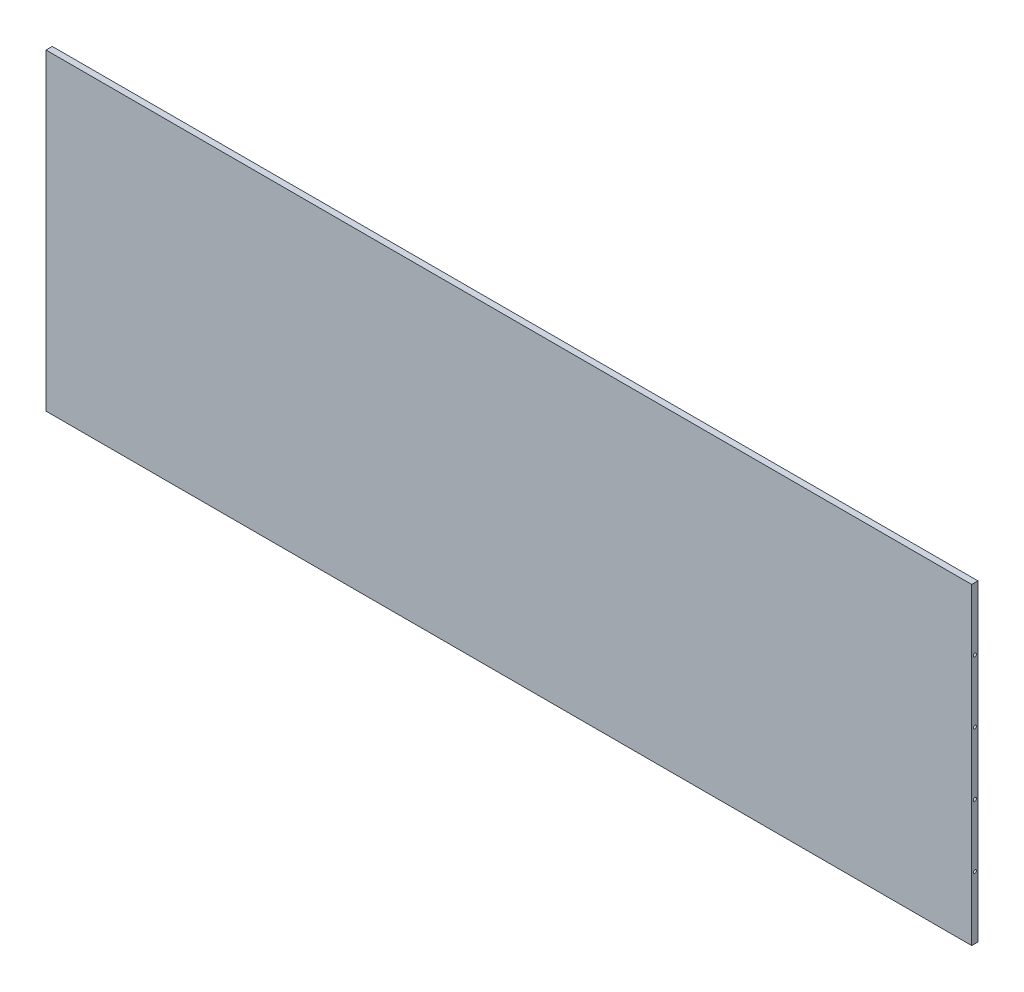
ISO-10303-21;
HEADER;
FILE_DESCRIPTION(('STEP AP214'),'2;1');
FILE_NAME('part.step','',(''),(''),'','','');
FILE_SCHEMA(('AUTOMOTIVE_DESIGN { 1 0 10303 214 1 1 1 1 }'));
ENDSEC;
DATA;
#1=APPLICATION_CONTEXT('core data for automotive mechanical design processes');
#2=APPLICATION_PROTOCOL_DEFINITION('international standard','automotive_design',2000,#1);
#3=PRODUCT_CONTEXT('',#1,'mechanical');
#4=PRODUCT('Part','Part','',(#3));
#5=PRODUCT_RELATED_PRODUCT_CATEGORY('part','',(#4));
#6=PRODUCT_DEFINITION_FORMATION('','',#4);
#7=PRODUCT_DEFINITION_CONTEXT('part definition',#1,'design');
#8=PRODUCT_DEFINITION('design','',#6,#7);
#9=PRODUCT_DEFINITION_SHAPE('','',#8);
#10=(LENGTH_UNIT() NAMED_UNIT(*) SI_UNIT(.MILLI.,.METRE.));
#11=(NAMED_UNIT(*) PLANE_ANGLE_UNIT() SI_UNIT($,.RADIAN.));
#12=(NAMED_UNIT(*) SI_UNIT($,.STERADIAN.) SOLID_ANGLE_UNIT());
#13=UNCERTAINTY_MEASURE_WITH_UNIT(LENGTH_MEASURE(1.E-05),#10,'distance_accuracy_value','');
#14=(GEOMETRIC_REPRESENTATION_CONTEXT(3) GLOBAL_UNCERTAINTY_ASSIGNED_CONTEXT((#13)) GLOBAL_UNIT_ASSIGNED_CONTEXT((#10,
#11,#12)) REPRESENTATION_CONTEXT('',''));
#15=CARTESIAN_POINT('',(0.,0.,0.));
#16=DIRECTION('',(0.,0.,1.));
#17=DIRECTION('',(1.,0.,0.));
#18=AXIS2_PLACEMENT_3D('',#15,#16,#17);
#19=CARTESIAN_POINT('',(740.,-250.,5.));
#20=DIRECTION('',(-1.,0.,0.));
#21=DIRECTION('',(0.,0.,1.));
#22=AXIS2_PLACEMENT_3D('',#19,#20,#21);
#23=PLANE('',#22);
#24=CARTESIAN_POINT('',(740.,50.,-6.98296267768627E-13));
#25=DIRECTION('',(-1.,0.,0.));
#26=DIRECTION('',(0.,0.,1.));
#27=AXIS2_PLACEMENT_3D('',#24,#25,#26);
#28=CIRCLE('',#27,2.5);
#29=CARTESIAN_POINT('',(740.,50.,2.4999999999993));
#30=VERTEX_POINT('',#29);
#31=EDGE_CURVE('E237',#30,#30,#28,.T.);
#32=ORIENTED_EDGE('',*,*,#31,.T.);
#33=EDGE_LOOP('',(#32));
#34=FACE_BOUND('',#33,.T.);
#35=CARTESIAN_POINT('',(740.,-150.,0.));
#36=DIRECTION('',(-1.,0.,0.));
#37=DIRECTION('',(0.,0.,1.));
#38=AXIS2_PLACEMENT_3D('',#35,#36,#37);
#39=CIRCLE('',#38,2.5);
#40=CARTESIAN_POINT('',(740.,-150.,2.5));
#41=VERTEX_POINT('',#40);
#42=EDGE_CURVE('E225',#41,#41,#39,.T.);
#43=ORIENTED_EDGE('',*,*,#42,.T.);
#44=EDGE_LOOP('',(#43));
#45=FACE_BOUND('',#44,.T.);
#46=DIRECTION('',(0.,1.,0.));
#47=VECTOR('',#46,1.);
#48=CARTESIAN_POINT('',(740.,-250.,-5.));
#49=LINE('',#48,#47);
#50=CARTESIAN_POINT('',(740.,-250.,-5.));
#51=VERTEX_POINT('',#50);
#52=CARTESIAN_POINT('',(740.,250.,-5.));
#53=VERTEX_POINT('',#52);
#54=EDGE_CURVE('E96',#51,#53,#49,.T.);
#55=ORIENTED_EDGE('',*,*,#54,.T.);
#56=DIRECTION('',(0.,0.,-1.));
#57=VECTOR('',#56,1.);
#58=CARTESIAN_POINT('',(740.,250.,5.));
#59=LINE('',#58,#57);
#60=CARTESIAN_POINT('',(740.,250.,5.));
#61=VERTEX_POINT('',#60);
#62=EDGE_CURVE('E11',#61,#53,#59,.T.);
#63=ORIENTED_EDGE('',*,*,#62,.F.);
#64=DIRECTION('',(0.,1.,0.));
#65=VECTOR('',#64,1.);
#66=CARTESIAN_POINT('',(740.,-250.,5.));
#67=LINE('',#66,#65);
#68=CARTESIAN_POINT('',(740.,-250.,5.));
#69=VERTEX_POINT('',#68);
#70=EDGE_CURVE('E84',#69,#61,#67,.T.);
#71=ORIENTED_EDGE('',*,*,#70,.F.);
#72=DIRECTION('',(0.,0.,-1.));
#73=VECTOR('',#72,1.);
#74=CARTESIAN_POINT('',(740.,-250.,5.));
#75=LINE('',#74,#73);
#76=EDGE_CURVE('E92',#69,#51,#75,.T.);
#77=ORIENTED_EDGE('',*,*,#76,.T.);
#78=EDGE_LOOP('',(#55,#63,#71,#77));
#79=FACE_BOUND('',#78,.T.);
#80=CARTESIAN_POINT('',(740.,-50.,-3.49148133884313E-13));
#81=DIRECTION('',(-1.,0.,0.));
#82=DIRECTION('',(0.,0.,1.));
#83=AXIS2_PLACEMENT_3D('',#80,#81,#82);
#84=CIRCLE('',#83,2.5);
#85=CARTESIAN_POINT('',(740.,-50.,2.49999999999965));
#86=VERTEX_POINT('',#85);
#87=EDGE_CURVE('E231',#86,#86,#84,.T.);
#88=ORIENTED_EDGE('',*,*,#87,.T.);
#89=EDGE_LOOP('',(#88));
#90=FACE_BOUND('',#89,.T.);
#91=CARTESIAN_POINT('',(740.,150.,-1.04744440165294E-12));
#92=DIRECTION('',(-1.,0.,0.));
#93=DIRECTION('',(0.,0.,1.));
#94=AXIS2_PLACEMENT_3D('',#91,#92,#93);
#95=CIRCLE('',#94,2.5);
#96=CARTESIAN_POINT('',(740.,150.,2.49999999999895));
#97=VERTEX_POINT('',#96);
#98=EDGE_CURVE('E243',#97,#97,#95,.T.);
#99=ORIENTED_EDGE('',*,*,#98,.T.);
#100=EDGE_LOOP('',(#99));
#101=FACE_BOUND('',#100,.T.);
#102=ADVANCED_FACE('F33',(#34,#45,#79,#90,#101),#23,.F.);
#103=CARTESIAN_POINT('',(-740.,250.,5.));
#104=DIRECTION('',(0.,-1.,0.));
#105=DIRECTION('',(0.,0.,-1.));
#106=AXIS2_PLACEMENT_3D('',#103,#104,#105);
#107=PLANE('',#106);
#108=DIRECTION('',(-1.,0.,0.));
#109=VECTOR('',#108,1.);
#110=CARTESIAN_POINT('',(-740.,250.,-5.));
#111=LINE('',#110,#109);
#112=CARTESIAN_POINT('',(-740.,250.,-5.));
#113=VERTEX_POINT('',#112);
#114=EDGE_CURVE('E88',#53,#113,#111,.T.);
#115=ORIENTED_EDGE('',*,*,#114,.T.);
#116=DIRECTION('',(0.,0.,-1.));
#117=VECTOR('',#116,1.);
#118=CARTESIAN_POINT('',(-740.,250.,5.));
#119=LINE('',#118,#117);
#120=CARTESIAN_POINT('',(-740.,250.,5.));
#121=VERTEX_POINT('',#120);
#122=EDGE_CURVE('E41',#121,#113,#119,.T.);
#123=ORIENTED_EDGE('',*,*,#122,.F.);
#124=DIRECTION('',(-1.,0.,0.));
#125=VECTOR('',#124,1.);
#126=CARTESIAN_POINT('',(-740.,250.,5.));
#127=LINE('',#126,#125);
#128=EDGE_CURVE('E79',#61,#121,#127,.T.);
#129=ORIENTED_EDGE('',*,*,#128,.F.);
#130=ORIENTED_EDGE('',*,*,#62,.T.);
#131=EDGE_LOOP('',(#115,#123,#129,#130));
#132=FACE_BOUND('',#131,.T.);
#133=ADVANCED_FACE('F87',(#132),#107,.F.);
#134=CARTESIAN_POINT('',(-740.,-250.,5.));
#135=DIRECTION('',(1.,0.,0.));
#136=DIRECTION('',(0.,0.,-1.));
#137=AXIS2_PLACEMENT_3D('',#134,#135,#136);
#138=PLANE('',#137);
#139=CARTESIAN_POINT('',(-740.,150.,-1.04744440165294E-12));
#140=DIRECTION('',(-1.,0.,0.));
#141=DIRECTION('',(0.,0.,1.));
#142=AXIS2_PLACEMENT_3D('',#139,#140,#141);
#143=CIRCLE('',#142,2.5);
#144=CARTESIAN_POINT('',(-740.,150.,2.49999999999895));
#145=VERTEX_POINT('',#144);
#146=EDGE_CURVE('E219',#145,#145,#143,.T.);
#147=ORIENTED_EDGE('',*,*,#146,.F.);
#148=EDGE_LOOP('',(#147));
#149=FACE_BOUND('',#148,.T.);
#150=CARTESIAN_POINT('',(-740.,50.,-6.98296267768627E-13));
#151=DIRECTION('',(-1.,0.,0.));
#152=DIRECTION('',(0.,0.,1.));
#153=AXIS2_PLACEMENT_3D('',#150,#151,#152);
#154=CIRCLE('',#153,2.5);
#155=CARTESIAN_POINT('',(-740.,50.,2.4999999999993));
#156=VERTEX_POINT('',#155);
#157=EDGE_CURVE('E213',#156,#156,#154,.T.);
#158=ORIENTED_EDGE('',*,*,#157,.F.);
#159=EDGE_LOOP('',(#158));
#160=FACE_BOUND('',#159,.T.);
#161=CARTESIAN_POINT('',(-740.,-50.,-3.49148133884313E-13));
#162=DIRECTION('',(-1.,0.,0.));
#163=DIRECTION('',(0.,0.,1.));
#164=AXIS2_PLACEMENT_3D('',#161,#162,#163);
#165=CIRCLE('',#164,2.5);
#166=CARTESIAN_POINT('',(-740.,-50.,2.49999999999965));
#167=VERTEX_POINT('',#166);
#168=EDGE_CURVE('E207',#167,#167,#165,.T.);
#169=ORIENTED_EDGE('',*,*,#168,.F.);
#170=EDGE_LOOP('',(#169));
#171=FACE_BOUND('',#170,.T.);
#172=CARTESIAN_POINT('',(-740.,-150.,0.));
#173=DIRECTION('',(-1.,0.,0.));
#174=DIRECTION('',(0.,0.,1.));
#175=AXIS2_PLACEMENT_3D('',#172,#173,#174);
#176=CIRCLE('',#175,2.5);
#177=CARTESIAN_POINT('',(-740.,-150.,2.5));
#178=VERTEX_POINT('',#177);
#179=EDGE_CURVE('E201',#178,#178,#176,.T.);
#180=ORIENTED_EDGE('',*,*,#179,.F.);
#181=EDGE_LOOP('',(#180));
#182=FACE_BOUND('',#181,.T.);
#183=DIRECTION('',(0.,-1.,0.));
#184=VECTOR('',#183,1.);
#185=CARTESIAN_POINT('',(-740.,-250.,-5.));
#186=LINE('',#185,#184);
#187=CARTESIAN_POINT('',(-740.,-250.,-5.));
#188=VERTEX_POINT('',#187);
#189=EDGE_CURVE('E66',#113,#188,#186,.T.);
#190=ORIENTED_EDGE('',*,*,#189,.T.);
#191=DIRECTION('',(0.,0.,-1.));
#192=VECTOR('',#191,1.);
#193=CARTESIAN_POINT('',(-740.,-250.,5.));
#194=LINE('',#193,#192);
#195=CARTESIAN_POINT('',(-740.,-250.,5.));
#196=VERTEX_POINT('',#195);
#197=EDGE_CURVE('E89',#196,#188,#194,.T.);
#198=ORIENTED_EDGE('',*,*,#197,.F.);
#199=DIRECTION('',(0.,-1.,0.));
#200=VECTOR('',#199,1.);
#201=CARTESIAN_POINT('',(-740.,-250.,5.));
#202=LINE('',#201,#200);
#203=EDGE_CURVE('E82',#121,#196,#202,.T.);
#204=ORIENTED_EDGE('',*,*,#203,.F.);
#205=ORIENTED_EDGE('',*,*,#122,.T.);
#206=EDGE_LOOP('',(#190,#198,#204,#205));
#207=FACE_BOUND('',#206,.T.);
#208=ADVANCED_FACE('F90',(#149,#160,#171,#182,#207),#138,.F.);
#209=CARTESIAN_POINT('',(-740.,-250.,5.));
#210=DIRECTION('',(0.,1.,0.));
#211=DIRECTION('',(0.,0.,1.));
#212=AXIS2_PLACEMENT_3D('',#209,#210,#211);
#213=PLANE('',#212);
#214=CARTESIAN_POINT('',(710.,-250.,0.));
#215=DIRECTION('',(0.,-1.,0.));
#216=DIRECTION('',(0.,0.,-1.));
#217=AXIS2_PLACEMENT_3D('',#214,#215,#216);
#218=CIRCLE('',#217,2.49999999999991);
#219=CARTESIAN_POINT('',(710.,-250.,-2.49999999999991));
#220=VERTEX_POINT('',#219);
#221=EDGE_CURVE('E195',#220,#220,#218,.T.);
#222=ORIENTED_EDGE('',*,*,#221,.F.);
#223=EDGE_LOOP('',(#222));
#224=FACE_BOUND('',#223,.T.);
#225=CARTESIAN_POINT('',(610.,-250.,0.));
#226=DIRECTION('',(0.,-1.,0.));
#227=DIRECTION('',(0.,0.,-1.));
#228=AXIS2_PLACEMENT_3D('',#225,#226,#227);
#229=CIRCLE('',#228,2.49999999999991);
#230=CARTESIAN_POINT('',(610.,-250.,-2.49999999999991));
#231=VERTEX_POINT('',#230);
#232=EDGE_CURVE('E189',#231,#231,#229,.T.);
#233=ORIENTED_EDGE('',*,*,#232,.F.);
#234=EDGE_LOOP('',(#233));
#235=FACE_BOUND('',#234,.T.);
#236=CARTESIAN_POINT('',(510.,-250.,0.));
#237=DIRECTION('',(0.,-1.,0.));
#238=DIRECTION('',(0.,0.,-1.));
#239=AXIS2_PLACEMENT_3D('',#236,#237,#238);
#240=CIRCLE('',#239,2.49999999999991);
#241=CARTESIAN_POINT('',(510.,-250.,-2.49999999999991));
#242=VERTEX_POINT('',#241);
#243=EDGE_CURVE('E183',#242,#242,#240,.T.);
#244=ORIENTED_EDGE('',*,*,#243,.F.);
#245=EDGE_LOOP('',(#244));
#246=FACE_BOUND('',#245,.T.);
#247=CARTESIAN_POINT('',(410.,-250.,0.));
#248=DIRECTION('',(0.,-1.,0.));
#249=DIRECTION('',(0.,0.,-1.));
#250=AXIS2_PLACEMENT_3D('',#247,#248,#249);
#251=CIRCLE('',#250,2.49999999999991);
#252=CARTESIAN_POINT('',(410.,-250.,-2.49999999999991));
#253=VERTEX_POINT('',#252);
#254=EDGE_CURVE('E177',#253,#253,#251,.T.);
#255=ORIENTED_EDGE('',*,*,#254,.F.);
#256=EDGE_LOOP('',(#255));
#257=FACE_BOUND('',#256,.T.);
#258=CARTESIAN_POINT('',(310.,-250.,0.));
#259=DIRECTION('',(0.,-1.,0.));
#260=DIRECTION('',(0.,0.,-1.));
#261=AXIS2_PLACEMENT_3D('',#258,#259,#260);
#262=CIRCLE('',#261,2.49999999999991);
#263=CARTESIAN_POINT('',(310.,-250.,-2.49999999999991));
#264=VERTEX_POINT('',#263);
#265=EDGE_CURVE('E171',#264,#264,#262,.T.);
#266=ORIENTED_EDGE('',*,*,#265,.F.);
#267=EDGE_LOOP('',(#266));
#268=FACE_BOUND('',#267,.T.);
#269=CARTESIAN_POINT('',(210.,-250.,0.));
#270=DIRECTION('',(0.,-1.,0.));
#271=DIRECTION('',(0.,0.,-1.));
#272=AXIS2_PLACEMENT_3D('',#269,#270,#271);
#273=CIRCLE('',#272,2.49999999999991);
#274=CARTESIAN_POINT('',(210.,-250.,-2.49999999999991));
#275=VERTEX_POINT('',#274);
#276=EDGE_CURVE('E165',#275,#275,#273,.T.);
#277=ORIENTED_EDGE('',*,*,#276,.F.);
#278=EDGE_LOOP('',(#277));
#279=FACE_BOUND('',#278,.T.);
#280=CARTESIAN_POINT('',(110.,-250.,0.));
#281=DIRECTION('',(0.,-1.,0.));
#282=DIRECTION('',(0.,0.,-1.));
#283=AXIS2_PLACEMENT_3D('',#280,#281,#282);
#284=CIRCLE('',#283,2.49999999999991);
#285=CARTESIAN_POINT('',(110.,-250.,-2.49999999999991));
#286=VERTEX_POINT('',#285);
#287=EDGE_CURVE('E159',#286,#286,#284,.T.);
#288=ORIENTED_EDGE('',*,*,#287,.F.);
#289=EDGE_LOOP('',(#288));
#290=FACE_BOUND('',#289,.T.);
#291=CARTESIAN_POINT('',(10.0000000000001,-250.,0.));
#292=DIRECTION('',(0.,-1.,0.));
#293=DIRECTION('',(0.,0.,-1.));
#294=AXIS2_PLACEMENT_3D('',#291,#292,#293);
#295=CIRCLE('',#294,2.49999999999991);
#296=CARTESIAN_POINT('',(10.0000000000001,-250.,-2.49999999999991));
#297=VERTEX_POINT('',#296);
#298=EDGE_CURVE('E153',#297,#297,#295,.T.);
#299=ORIENTED_EDGE('',*,*,#298,.F.);
#300=EDGE_LOOP('',(#299));
#301=FACE_BOUND('',#300,.T.);
#302=CARTESIAN_POINT('',(-89.9999999999999,-250.,0.));
#303=DIRECTION('',(0.,-1.,0.));
#304=DIRECTION('',(0.,0.,-1.));
#305=AXIS2_PLACEMENT_3D('',#302,#303,#304);
#306=CIRCLE('',#305,2.49999999999991);
#307=CARTESIAN_POINT('',(-89.9999999999999,-250.,-2.49999999999991));
#308=VERTEX_POINT('',#307);
#309=EDGE_CURVE('E147',#308,#308,#306,.T.);
#310=ORIENTED_EDGE('',*,*,#309,.F.);
#311=EDGE_LOOP('',(#310));
#312=FACE_BOUND('',#311,.T.);
#313=CARTESIAN_POINT('',(-190.,-250.,0.));
#314=DIRECTION('',(0.,-1.,0.));
#315=DIRECTION('',(0.,0.,-1.));
#316=AXIS2_PLACEMENT_3D('',#313,#314,#315);
#317=CIRCLE('',#316,2.49999999999991);
#318=CARTESIAN_POINT('',(-190.,-250.,-2.49999999999991));
#319=VERTEX_POINT('',#318);
#320=EDGE_CURVE('E141',#319,#319,#317,.T.);
#321=ORIENTED_EDGE('',*,*,#320,.F.);
#322=EDGE_LOOP('',(#321));
#323=FACE_BOUND('',#322,.T.);
#324=CARTESIAN_POINT('',(-290.,-250.,0.));
#325=DIRECTION('',(0.,-1.,0.));
#326=DIRECTION('',(0.,0.,-1.));
#327=AXIS2_PLACEMENT_3D('',#324,#325,#326);
#328=CIRCLE('',#327,2.49999999999991);
#329=CARTESIAN_POINT('',(-290.,-250.,-2.49999999999991));
#330=VERTEX_POINT('',#329);
#331=EDGE_CURVE('E135',#330,#330,#328,.T.);
#332=ORIENTED_EDGE('',*,*,#331,.F.);
#333=EDGE_LOOP('',(#332));
#334=FACE_BOUND('',#333,.T.);
#335=CARTESIAN_POINT('',(-390.,-250.,0.));
#336=DIRECTION('',(0.,-1.,0.));
#337=DIRECTION('',(0.,0.,-1.));
#338=AXIS2_PLACEMENT_3D('',#335,#336,#337);
#339=CIRCLE('',#338,2.49999999999991);
#340=CARTESIAN_POINT('',(-390.,-250.,-2.49999999999991));
#341=VERTEX_POINT('',#340);
#342=EDGE_CURVE('E129',#341,#341,#339,.T.);
#343=ORIENTED_EDGE('',*,*,#342,.F.);
#344=EDGE_LOOP('',(#343));
#345=FACE_BOUND('',#344,.T.);
#346=CARTESIAN_POINT('',(-490.,-250.,0.));
#347=DIRECTION('',(0.,-1.,0.));
#348=DIRECTION('',(0.,0.,-1.));
#349=AXIS2_PLACEMENT_3D('',#346,#347,#348);
#350=CIRCLE('',#349,2.49999999999991);
#351=CARTESIAN_POINT('',(-490.,-250.,-2.49999999999991));
#352=VERTEX_POINT('',#351);
#353=EDGE_CURVE('E123',#352,#352,#350,.T.);
#354=ORIENTED_EDGE('',*,*,#353,.F.);
#355=EDGE_LOOP('',(#354));
#356=FACE_BOUND('',#355,.T.);
#357=CARTESIAN_POINT('',(-590.,-250.,0.));
#358=DIRECTION('',(0.,-1.,0.));
#359=DIRECTION('',(0.,0.,-1.));
#360=AXIS2_PLACEMENT_3D('',#357,#358,#359);
#361=CIRCLE('',#360,2.49999999999991);
#362=CARTESIAN_POINT('',(-590.,-250.,-2.49999999999991));
#363=VERTEX_POINT('',#362);
#364=EDGE_CURVE('E117',#363,#363,#361,.T.);
#365=ORIENTED_EDGE('',*,*,#364,.F.);
#366=EDGE_LOOP('',(#365));
#367=FACE_BOUND('',#366,.T.);
#368=CARTESIAN_POINT('',(-690.,-250.,0.));
#369=DIRECTION('',(0.,-1.,0.));
#370=DIRECTION('',(0.,0.,-1.));
#371=AXIS2_PLACEMENT_3D('',#368,#369,#370);
#372=CIRCLE('',#371,2.49999999999991);
#373=CARTESIAN_POINT('',(-690.,-250.,-2.49999999999991));
#374=VERTEX_POINT('',#373);
#375=EDGE_CURVE('E111',#374,#374,#372,.T.);
#376=ORIENTED_EDGE('',*,*,#375,.F.);
#377=EDGE_LOOP('',(#376));
#378=FACE_BOUND('',#377,.T.);
#379=DIRECTION('',(1.,0.,0.));
#380=VECTOR('',#379,1.);
#381=CARTESIAN_POINT('',(-740.,-250.,-5.));
#382=LINE('',#381,#380);
#383=EDGE_CURVE('E72',#188,#51,#382,.T.);
#384=ORIENTED_EDGE('',*,*,#383,.T.);
#385=ORIENTED_EDGE('',*,*,#76,.F.);
#386=DIRECTION('',(1.,0.,0.));
#387=VECTOR('',#386,1.);
#388=CARTESIAN_POINT('',(-740.,-250.,5.));
#389=LINE('',#388,#387);
#390=EDGE_CURVE('E49',#196,#69,#389,.T.);
#391=ORIENTED_EDGE('',*,*,#390,.F.);
#392=ORIENTED_EDGE('',*,*,#197,.T.);
#393=EDGE_LOOP('',(#384,#385,#391,#392));
#394=FACE_BOUND('',#393,.T.);
#395=ADVANCED_FACE('F104',(#224,#235,#246,#257,#268,#279,#290,#301,#312,#323,#334,#345,#356,
#367,#378,#394),#213,.F.);
#396=CARTESIAN_POINT('',(0.,0.,5.));
#397=DIRECTION('',(0.,0.,-1.));
#398=DIRECTION('',(-1.,0.,0.));
#399=AXIS2_PLACEMENT_3D('',#396,#397,#398);
#400=PLANE('',#399);
#401=ORIENTED_EDGE('',*,*,#70,.T.);
#402=ORIENTED_EDGE('',*,*,#128,.T.);
#403=ORIENTED_EDGE('',*,*,#203,.T.);
#404=ORIENTED_EDGE('',*,*,#390,.T.);
#405=EDGE_LOOP('',(#401,#402,#403,#404));
#406=FACE_BOUND('',#405,.T.);
#407=ADVANCED_FACE('F80',(#406),#400,.F.);
#408=CARTESIAN_POINT('',(0.,0.,-5.));
#409=DIRECTION('',(0.,0.,-1.));
#410=DIRECTION('',(-1.,0.,0.));
#411=AXIS2_PLACEMENT_3D('',#408,#409,#410);
#412=PLANE('',#411);
#413=ORIENTED_EDGE('',*,*,#54,.F.);
#414=ORIENTED_EDGE('',*,*,#383,.F.);
#415=ORIENTED_EDGE('',*,*,#189,.F.);
#416=ORIENTED_EDGE('',*,*,#114,.F.);
#417=EDGE_LOOP('',(#413,#414,#415,#416));
#418=FACE_BOUND('',#417,.T.);
#419=ADVANCED_FACE('F107',(#418),#412,.T.);
#420=CARTESIAN_POINT('',(-690.,-245.,0.));
#421=DIRECTION('',(0.,-1.,0.));
#422=DIRECTION('',(0.,0.,-1.));
#423=AXIS2_PLACEMENT_3D('',#420,#421,#422);
#424=CYLINDRICAL_SURFACE('',#423,2.49999999999991);
#425=CARTESIAN_POINT('',(-690.,-245.,0.));
#426=DIRECTION('',(0.,-1.,0.));
#427=DIRECTION('',(0.,0.,-1.));
#428=AXIS2_PLACEMENT_3D('',#425,#426,#427);
#429=CIRCLE('',#428,2.49999999999991);
#430=CARTESIAN_POINT('',(-690.,-245.,-2.49999999999991));
#431=VERTEX_POINT('',#430);
#432=EDGE_CURVE('E99',#431,#431,#429,.T.);
#433=ORIENTED_EDGE('',*,*,#432,.F.);
#434=EDGE_LOOP('',(#433));
#435=FACE_BOUND('',#434,.T.);
#436=ORIENTED_EDGE('',*,*,#375,.T.);
#437=EDGE_LOOP('',(#436));
#438=FACE_BOUND('',#437,.T.);
#439=ADVANCED_FACE('F429',(#435,#438),#424,.F.);
#440=CARTESIAN_POINT('',(-690.,-245.,0.));
#441=DIRECTION('',(0.,-1.,0.));
#442=DIRECTION('',(0.,0.,-1.));
#443=AXIS2_PLACEMENT_3D('',#440,#441,#442);
#444=PLANE('',#443);
#445=ORIENTED_EDGE('',*,*,#432,.T.);
#446=EDGE_LOOP('',(#445));
#447=FACE_BOUND('',#446,.T.);
#448=ADVANCED_FACE('F425',(#447),#444,.T.);
#449=CARTESIAN_POINT('',(-590.,-245.,0.));
#450=DIRECTION('',(0.,-1.,0.));
#451=DIRECTION('',(0.,0.,-1.));
#452=AXIS2_PLACEMENT_3D('',#449,#450,#451);
#453=CYLINDRICAL_SURFACE('',#452,2.49999999999991);
#454=CARTESIAN_POINT('',(-590.,-245.,0.));
#455=DIRECTION('',(0.,-1.,0.));
#456=DIRECTION('',(0.,0.,-1.));
#457=AXIS2_PLACEMENT_3D('',#454,#455,#456);
#458=CIRCLE('',#457,2.49999999999991);
#459=CARTESIAN_POINT('',(-590.,-245.,-2.49999999999991));
#460=VERTEX_POINT('',#459);
#461=EDGE_CURVE('E114',#460,#460,#458,.T.);
#462=ORIENTED_EDGE('',*,*,#461,.F.);
#463=EDGE_LOOP('',(#462));
#464=FACE_BOUND('',#463,.T.);
#465=ORIENTED_EDGE('',*,*,#364,.T.);
#466=EDGE_LOOP('',(#465));
#467=FACE_BOUND('',#466,.T.);
#468=ADVANCED_FACE('F421',(#464,#467),#453,.F.);
#469=CARTESIAN_POINT('',(-590.,-245.,0.));
#470=DIRECTION('',(0.,-1.,0.));
#471=DIRECTION('',(0.,0.,-1.));
#472=AXIS2_PLACEMENT_3D('',#469,#470,#471);
#473=PLANE('',#472);
#474=ORIENTED_EDGE('',*,*,#461,.T.);
#475=EDGE_LOOP('',(#474));
#476=FACE_BOUND('',#475,.T.);
#477=ADVANCED_FACE('F417',(#476),#473,.T.);
#478=CARTESIAN_POINT('',(-490.,-245.,0.));
#479=DIRECTION('',(0.,-1.,0.));
#480=DIRECTION('',(0.,0.,-1.));
#481=AXIS2_PLACEMENT_3D('',#478,#479,#480);
#482=CYLINDRICAL_SURFACE('',#481,2.49999999999991);
#483=CARTESIAN_POINT('',(-490.,-245.,0.));
#484=DIRECTION('',(0.,-1.,0.));
#485=DIRECTION('',(0.,0.,-1.));
#486=AXIS2_PLACEMENT_3D('',#483,#484,#485);
#487=CIRCLE('',#486,2.49999999999991);
#488=CARTESIAN_POINT('',(-490.,-245.,-2.49999999999991));
#489=VERTEX_POINT('',#488);
#490=EDGE_CURVE('E120',#489,#489,#487,.T.);
#491=ORIENTED_EDGE('',*,*,#490,.F.);
#492=EDGE_LOOP('',(#491));
#493=FACE_BOUND('',#492,.T.);
#494=ORIENTED_EDGE('',*,*,#353,.T.);
#495=EDGE_LOOP('',(#494));
#496=FACE_BOUND('',#495,.T.);
#497=ADVANCED_FACE('F413',(#493,#496),#482,.F.);
#498=CARTESIAN_POINT('',(-490.,-245.,0.));
#499=DIRECTION('',(0.,-1.,0.));
#500=DIRECTION('',(0.,0.,-1.));
#501=AXIS2_PLACEMENT_3D('',#498,#499,#500);
#502=PLANE('',#501);
#503=ORIENTED_EDGE('',*,*,#490,.T.);
#504=EDGE_LOOP('',(#503));
#505=FACE_BOUND('',#504,.T.);
#506=ADVANCED_FACE('F409',(#505),#502,.T.);
#507=CARTESIAN_POINT('',(-390.,-245.,0.));
#508=DIRECTION('',(0.,-1.,0.));
#509=DIRECTION('',(0.,0.,-1.));
#510=AXIS2_PLACEMENT_3D('',#507,#508,#509);
#511=CYLINDRICAL_SURFACE('',#510,2.49999999999991);
#512=CARTESIAN_POINT('',(-390.,-245.,0.));
#513=DIRECTION('',(0.,-1.,0.));
#514=DIRECTION('',(0.,0.,-1.));
#515=AXIS2_PLACEMENT_3D('',#512,#513,#514);
#516=CIRCLE('',#515,2.49999999999991);
#517=CARTESIAN_POINT('',(-390.,-245.,-2.49999999999991));
#518=VERTEX_POINT('',#517);
#519=EDGE_CURVE('E126',#518,#518,#516,.T.);
#520=ORIENTED_EDGE('',*,*,#519,.F.);
#521=EDGE_LOOP('',(#520));
#522=FACE_BOUND('',#521,.T.);
#523=ORIENTED_EDGE('',*,*,#342,.T.);
#524=EDGE_LOOP('',(#523));
#525=FACE_BOUND('',#524,.T.);
#526=ADVANCED_FACE('F405',(#522,#525),#511,.F.);
#527=CARTESIAN_POINT('',(-390.,-245.,0.));
#528=DIRECTION('',(0.,-1.,0.));
#529=DIRECTION('',(0.,0.,-1.));
#530=AXIS2_PLACEMENT_3D('',#527,#528,#529);
#531=PLANE('',#530);
#532=ORIENTED_EDGE('',*,*,#519,.T.);
#533=EDGE_LOOP('',(#532));
#534=FACE_BOUND('',#533,.T.);
#535=ADVANCED_FACE('F401',(#534),#531,.T.);
#536=CARTESIAN_POINT('',(-290.,-245.,0.));
#537=DIRECTION('',(0.,-1.,0.));
#538=DIRECTION('',(0.,0.,-1.));
#539=AXIS2_PLACEMENT_3D('',#536,#537,#538);
#540=CYLINDRICAL_SURFACE('',#539,2.49999999999991);
#541=CARTESIAN_POINT('',(-290.,-245.,0.));
#542=DIRECTION('',(0.,-1.,0.));
#543=DIRECTION('',(0.,0.,-1.));
#544=AXIS2_PLACEMENT_3D('',#541,#542,#543);
#545=CIRCLE('',#544,2.49999999999991);
#546=CARTESIAN_POINT('',(-290.,-245.,-2.49999999999991));
#547=VERTEX_POINT('',#546);
#548=EDGE_CURVE('E132',#547,#547,#545,.T.);
#549=ORIENTED_EDGE('',*,*,#548,.F.);
#550=EDGE_LOOP('',(#549));
#551=FACE_BOUND('',#550,.T.);
#552=ORIENTED_EDGE('',*,*,#331,.T.);
#553=EDGE_LOOP('',(#552));
#554=FACE_BOUND('',#553,.T.);
#555=ADVANCED_FACE('F397',(#551,#554),#540,.F.);
#556=CARTESIAN_POINT('',(-290.,-245.,0.));
#557=DIRECTION('',(0.,-1.,0.));
#558=DIRECTION('',(0.,0.,-1.));
#559=AXIS2_PLACEMENT_3D('',#556,#557,#558);
#560=PLANE('',#559);
#561=ORIENTED_EDGE('',*,*,#548,.T.);
#562=EDGE_LOOP('',(#561));
#563=FACE_BOUND('',#562,.T.);
#564=ADVANCED_FACE('F393',(#563),#560,.T.);
#565=CARTESIAN_POINT('',(-190.,-245.,0.));
#566=DIRECTION('',(0.,-1.,0.));
#567=DIRECTION('',(0.,0.,-1.));
#568=AXIS2_PLACEMENT_3D('',#565,#566,#567);
#569=CYLINDRICAL_SURFACE('',#568,2.49999999999991);
#570=CARTESIAN_POINT('',(-190.,-245.,0.));
#571=DIRECTION('',(0.,-1.,0.));
#572=DIRECTION('',(0.,0.,-1.));
#573=AXIS2_PLACEMENT_3D('',#570,#571,#572);
#574=CIRCLE('',#573,2.49999999999991);
#575=CARTESIAN_POINT('',(-190.,-245.,-2.49999999999991));
#576=VERTEX_POINT('',#575);
#577=EDGE_CURVE('E138',#576,#576,#574,.T.);
#578=ORIENTED_EDGE('',*,*,#577,.F.);
#579=EDGE_LOOP('',(#578));
#580=FACE_BOUND('',#579,.T.);
#581=ORIENTED_EDGE('',*,*,#320,.T.);
#582=EDGE_LOOP('',(#581));
#583=FACE_BOUND('',#582,.T.);
#584=ADVANCED_FACE('F389',(#580,#583),#569,.F.);
#585=CARTESIAN_POINT('',(-190.,-245.,0.));
#586=DIRECTION('',(0.,-1.,0.));
#587=DIRECTION('',(0.,0.,-1.));
#588=AXIS2_PLACEMENT_3D('',#585,#586,#587);
#589=PLANE('',#588);
#590=ORIENTED_EDGE('',*,*,#577,.T.);
#591=EDGE_LOOP('',(#590));
#592=FACE_BOUND('',#591,.T.);
#593=ADVANCED_FACE('F385',(#592),#589,.T.);
#594=CARTESIAN_POINT('',(-89.9999999999999,-245.,0.));
#595=DIRECTION('',(0.,-1.,0.));
#596=DIRECTION('',(0.,0.,-1.));
#597=AXIS2_PLACEMENT_3D('',#594,#595,#596);
#598=CYLINDRICAL_SURFACE('',#597,2.49999999999991);
#599=CARTESIAN_POINT('',(-89.9999999999999,-245.,0.));
#600=DIRECTION('',(0.,-1.,0.));
#601=DIRECTION('',(0.,0.,-1.));
#602=AXIS2_PLACEMENT_3D('',#599,#600,#601);
#603=CIRCLE('',#602,2.49999999999991);
#604=CARTESIAN_POINT('',(-89.9999999999999,-245.,-2.49999999999991));
#605=VERTEX_POINT('',#604);
#606=EDGE_CURVE('E144',#605,#605,#603,.T.);
#607=ORIENTED_EDGE('',*,*,#606,.F.);
#608=EDGE_LOOP('',(#607));
#609=FACE_BOUND('',#608,.T.);
#610=ORIENTED_EDGE('',*,*,#309,.T.);
#611=EDGE_LOOP('',(#610));
#612=FACE_BOUND('',#611,.T.);
#613=ADVANCED_FACE('F381',(#609,#612),#598,.F.);
#614=CARTESIAN_POINT('',(-89.9999999999999,-245.,0.));
#615=DIRECTION('',(0.,-1.,0.));
#616=DIRECTION('',(0.,0.,-1.));
#617=AXIS2_PLACEMENT_3D('',#614,#615,#616);
#618=PLANE('',#617);
#619=ORIENTED_EDGE('',*,*,#606,.T.);
#620=EDGE_LOOP('',(#619));
#621=FACE_BOUND('',#620,.T.);
#622=ADVANCED_FACE('F377',(#621),#618,.T.);
#623=CARTESIAN_POINT('',(10.0000000000001,-245.,0.));
#624=DIRECTION('',(0.,-1.,0.));
#625=DIRECTION('',(0.,0.,-1.));
#626=AXIS2_PLACEMENT_3D('',#623,#624,#625);
#627=CYLINDRICAL_SURFACE('',#626,2.49999999999991);
#628=CARTESIAN_POINT('',(10.0000000000001,-245.,0.));
#629=DIRECTION('',(0.,-1.,0.));
#630=DIRECTION('',(0.,0.,-1.));
#631=AXIS2_PLACEMENT_3D('',#628,#629,#630);
#632=CIRCLE('',#631,2.49999999999991);
#633=CARTESIAN_POINT('',(10.0000000000001,-245.,-2.49999999999991));
#634=VERTEX_POINT('',#633);
#635=EDGE_CURVE('E150',#634,#634,#632,.T.);
#636=ORIENTED_EDGE('',*,*,#635,.F.);
#637=EDGE_LOOP('',(#636));
#638=FACE_BOUND('',#637,.T.);
#639=ORIENTED_EDGE('',*,*,#298,.T.);
#640=EDGE_LOOP('',(#639));
#641=FACE_BOUND('',#640,.T.);
#642=ADVANCED_FACE('F373',(#638,#641),#627,.F.);
#643=CARTESIAN_POINT('',(10.0000000000001,-245.,0.));
#644=DIRECTION('',(0.,-1.,0.));
#645=DIRECTION('',(0.,0.,-1.));
#646=AXIS2_PLACEMENT_3D('',#643,#644,#645);
#647=PLANE('',#646);
#648=ORIENTED_EDGE('',*,*,#635,.T.);
#649=EDGE_LOOP('',(#648));
#650=FACE_BOUND('',#649,.T.);
#651=ADVANCED_FACE('F369',(#650),#647,.T.);
#652=CARTESIAN_POINT('',(110.,-245.,0.));
#653=DIRECTION('',(0.,-1.,0.));
#654=DIRECTION('',(0.,0.,-1.));
#655=AXIS2_PLACEMENT_3D('',#652,#653,#654);
#656=CYLINDRICAL_SURFACE('',#655,2.49999999999991);
#657=CARTESIAN_POINT('',(110.,-245.,0.));
#658=DIRECTION('',(0.,-1.,0.));
#659=DIRECTION('',(0.,0.,-1.));
#660=AXIS2_PLACEMENT_3D('',#657,#658,#659);
#661=CIRCLE('',#660,2.49999999999991);
#662=CARTESIAN_POINT('',(110.,-245.,-2.49999999999991));
#663=VERTEX_POINT('',#662);
#664=EDGE_CURVE('E156',#663,#663,#661,.T.);
#665=ORIENTED_EDGE('',*,*,#664,.F.);
#666=EDGE_LOOP('',(#665));
#667=FACE_BOUND('',#666,.T.);
#668=ORIENTED_EDGE('',*,*,#287,.T.);
#669=EDGE_LOOP('',(#668));
#670=FACE_BOUND('',#669,.T.);
#671=ADVANCED_FACE('F365',(#667,#670),#656,.F.);
#672=CARTESIAN_POINT('',(110.,-245.,0.));
#673=DIRECTION('',(0.,-1.,0.));
#674=DIRECTION('',(0.,0.,-1.));
#675=AXIS2_PLACEMENT_3D('',#672,#673,#674);
#676=PLANE('',#675);
#677=ORIENTED_EDGE('',*,*,#664,.T.);
#678=EDGE_LOOP('',(#677));
#679=FACE_BOUND('',#678,.T.);
#680=ADVANCED_FACE('F361',(#679),#676,.T.);
#681=CARTESIAN_POINT('',(210.,-245.,0.));
#682=DIRECTION('',(0.,-1.,0.));
#683=DIRECTION('',(0.,0.,-1.));
#684=AXIS2_PLACEMENT_3D('',#681,#682,#683);
#685=CYLINDRICAL_SURFACE('',#684,2.49999999999991);
#686=CARTESIAN_POINT('',(210.,-245.,0.));
#687=DIRECTION('',(0.,-1.,0.));
#688=DIRECTION('',(0.,0.,-1.));
#689=AXIS2_PLACEMENT_3D('',#686,#687,#688);
#690=CIRCLE('',#689,2.49999999999991);
#691=CARTESIAN_POINT('',(210.,-245.,-2.49999999999991));
#692=VERTEX_POINT('',#691);
#693=EDGE_CURVE('E162',#692,#692,#690,.T.);
#694=ORIENTED_EDGE('',*,*,#693,.F.);
#695=EDGE_LOOP('',(#694));
#696=FACE_BOUND('',#695,.T.);
#697=ORIENTED_EDGE('',*,*,#276,.T.);
#698=EDGE_LOOP('',(#697));
#699=FACE_BOUND('',#698,.T.);
#700=ADVANCED_FACE('F357',(#696,#699),#685,.F.);
#701=CARTESIAN_POINT('',(210.,-245.,0.));
#702=DIRECTION('',(0.,-1.,0.));
#703=DIRECTION('',(0.,0.,-1.));
#704=AXIS2_PLACEMENT_3D('',#701,#702,#703);
#705=PLANE('',#704);
#706=ORIENTED_EDGE('',*,*,#693,.T.);
#707=EDGE_LOOP('',(#706));
#708=FACE_BOUND('',#707,.T.);
#709=ADVANCED_FACE('F353',(#708),#705,.T.);
#710=CARTESIAN_POINT('',(310.,-245.,0.));
#711=DIRECTION('',(0.,-1.,0.));
#712=DIRECTION('',(0.,0.,-1.));
#713=AXIS2_PLACEMENT_3D('',#710,#711,#712);
#714=CYLINDRICAL_SURFACE('',#713,2.49999999999991);
#715=CARTESIAN_POINT('',(310.,-245.,0.));
#716=DIRECTION('',(0.,-1.,0.));
#717=DIRECTION('',(0.,0.,-1.));
#718=AXIS2_PLACEMENT_3D('',#715,#716,#717);
#719=CIRCLE('',#718,2.49999999999991);
#720=CARTESIAN_POINT('',(310.,-245.,-2.49999999999991));
#721=VERTEX_POINT('',#720);
#722=EDGE_CURVE('E168',#721,#721,#719,.T.);
#723=ORIENTED_EDGE('',*,*,#722,.F.);
#724=EDGE_LOOP('',(#723));
#725=FACE_BOUND('',#724,.T.);
#726=ORIENTED_EDGE('',*,*,#265,.T.);
#727=EDGE_LOOP('',(#726));
#728=FACE_BOUND('',#727,.T.);
#729=ADVANCED_FACE('F349',(#725,#728),#714,.F.);
#730=CARTESIAN_POINT('',(310.,-245.,0.));
#731=DIRECTION('',(0.,-1.,0.));
#732=DIRECTION('',(0.,0.,-1.));
#733=AXIS2_PLACEMENT_3D('',#730,#731,#732);
#734=PLANE('',#733);
#735=ORIENTED_EDGE('',*,*,#722,.T.);
#736=EDGE_LOOP('',(#735));
#737=FACE_BOUND('',#736,.T.);
#738=ADVANCED_FACE('F345',(#737),#734,.T.);
#739=CARTESIAN_POINT('',(410.,-245.,0.));
#740=DIRECTION('',(0.,-1.,0.));
#741=DIRECTION('',(0.,0.,-1.));
#742=AXIS2_PLACEMENT_3D('',#739,#740,#741);
#743=CYLINDRICAL_SURFACE('',#742,2.49999999999991);
#744=CARTESIAN_POINT('',(410.,-245.,0.));
#745=DIRECTION('',(0.,-1.,0.));
#746=DIRECTION('',(0.,0.,-1.));
#747=AXIS2_PLACEMENT_3D('',#744,#745,#746);
#748=CIRCLE('',#747,2.49999999999991);
#749=CARTESIAN_POINT('',(410.,-245.,-2.49999999999991));
#750=VERTEX_POINT('',#749);
#751=EDGE_CURVE('E174',#750,#750,#748,.T.);
#752=ORIENTED_EDGE('',*,*,#751,.F.);
#753=EDGE_LOOP('',(#752));
#754=FACE_BOUND('',#753,.T.);
#755=ORIENTED_EDGE('',*,*,#254,.T.);
#756=EDGE_LOOP('',(#755));
#757=FACE_BOUND('',#756,.T.);
#758=ADVANCED_FACE('F341',(#754,#757),#743,.F.);
#759=CARTESIAN_POINT('',(410.,-245.,0.));
#760=DIRECTION('',(0.,-1.,0.));
#761=DIRECTION('',(0.,0.,-1.));
#762=AXIS2_PLACEMENT_3D('',#759,#760,#761);
#763=PLANE('',#762);
#764=ORIENTED_EDGE('',*,*,#751,.T.);
#765=EDGE_LOOP('',(#764));
#766=FACE_BOUND('',#765,.T.);
#767=ADVANCED_FACE('F337',(#766),#763,.T.);
#768=CARTESIAN_POINT('',(510.,-245.,0.));
#769=DIRECTION('',(0.,-1.,0.));
#770=DIRECTION('',(0.,0.,-1.));
#771=AXIS2_PLACEMENT_3D('',#768,#769,#770);
#772=CYLINDRICAL_SURFACE('',#771,2.49999999999991);
#773=CARTESIAN_POINT('',(510.,-245.,0.));
#774=DIRECTION('',(0.,-1.,0.));
#775=DIRECTION('',(0.,0.,-1.));
#776=AXIS2_PLACEMENT_3D('',#773,#774,#775);
#777=CIRCLE('',#776,2.49999999999991);
#778=CARTESIAN_POINT('',(510.,-245.,-2.49999999999991));
#779=VERTEX_POINT('',#778);
#780=EDGE_CURVE('E180',#779,#779,#777,.T.);
#781=ORIENTED_EDGE('',*,*,#780,.F.);
#782=EDGE_LOOP('',(#781));
#783=FACE_BOUND('',#782,.T.);
#784=ORIENTED_EDGE('',*,*,#243,.T.);
#785=EDGE_LOOP('',(#784));
#786=FACE_BOUND('',#785,.T.);
#787=ADVANCED_FACE('F333',(#783,#786),#772,.F.);
#788=CARTESIAN_POINT('',(510.,-245.,0.));
#789=DIRECTION('',(0.,-1.,0.));
#790=DIRECTION('',(0.,0.,-1.));
#791=AXIS2_PLACEMENT_3D('',#788,#789,#790);
#792=PLANE('',#791);
#793=ORIENTED_EDGE('',*,*,#780,.T.);
#794=EDGE_LOOP('',(#793));
#795=FACE_BOUND('',#794,.T.);
#796=ADVANCED_FACE('F329',(#795),#792,.T.);
#797=CARTESIAN_POINT('',(610.,-245.,0.));
#798=DIRECTION('',(0.,-1.,0.));
#799=DIRECTION('',(0.,0.,-1.));
#800=AXIS2_PLACEMENT_3D('',#797,#798,#799);
#801=CYLINDRICAL_SURFACE('',#800,2.49999999999991);
#802=CARTESIAN_POINT('',(610.,-245.,0.));
#803=DIRECTION('',(0.,-1.,0.));
#804=DIRECTION('',(0.,0.,-1.));
#805=AXIS2_PLACEMENT_3D('',#802,#803,#804);
#806=CIRCLE('',#805,2.49999999999991);
#807=CARTESIAN_POINT('',(610.,-245.,-2.49999999999991));
#808=VERTEX_POINT('',#807);
#809=EDGE_CURVE('E186',#808,#808,#806,.T.);
#810=ORIENTED_EDGE('',*,*,#809,.F.);
#811=EDGE_LOOP('',(#810));
#812=FACE_BOUND('',#811,.T.);
#813=ORIENTED_EDGE('',*,*,#232,.T.);
#814=EDGE_LOOP('',(#813));
#815=FACE_BOUND('',#814,.T.);
#816=ADVANCED_FACE('F325',(#812,#815),#801,.F.);
#817=CARTESIAN_POINT('',(610.,-245.,0.));
#818=DIRECTION('',(0.,-1.,0.));
#819=DIRECTION('',(0.,0.,-1.));
#820=AXIS2_PLACEMENT_3D('',#817,#818,#819);
#821=PLANE('',#820);
#822=ORIENTED_EDGE('',*,*,#809,.T.);
#823=EDGE_LOOP('',(#822));
#824=FACE_BOUND('',#823,.T.);
#825=ADVANCED_FACE('F321',(#824),#821,.T.);
#826=CARTESIAN_POINT('',(710.,-245.,0.));
#827=DIRECTION('',(0.,-1.,0.));
#828=DIRECTION('',(0.,0.,-1.));
#829=AXIS2_PLACEMENT_3D('',#826,#827,#828);
#830=CYLINDRICAL_SURFACE('',#829,2.49999999999991);
#831=CARTESIAN_POINT('',(710.,-245.,0.));
#832=DIRECTION('',(0.,-1.,0.));
#833=DIRECTION('',(0.,0.,-1.));
#834=AXIS2_PLACEMENT_3D('',#831,#832,#833);
#835=CIRCLE('',#834,2.49999999999991);
#836=CARTESIAN_POINT('',(710.,-245.,-2.49999999999991));
#837=VERTEX_POINT('',#836);
#838=EDGE_CURVE('E192',#837,#837,#835,.T.);
#839=ORIENTED_EDGE('',*,*,#838,.F.);
#840=EDGE_LOOP('',(#839));
#841=FACE_BOUND('',#840,.T.);
#842=ORIENTED_EDGE('',*,*,#221,.T.);
#843=EDGE_LOOP('',(#842));
#844=FACE_BOUND('',#843,.T.);
#845=ADVANCED_FACE('F317',(#841,#844),#830,.F.);
#846=CARTESIAN_POINT('',(710.,-245.,0.));
#847=DIRECTION('',(0.,-1.,0.));
#848=DIRECTION('',(0.,0.,-1.));
#849=AXIS2_PLACEMENT_3D('',#846,#847,#848);
#850=PLANE('',#849);
#851=ORIENTED_EDGE('',*,*,#838,.T.);
#852=EDGE_LOOP('',(#851));
#853=FACE_BOUND('',#852,.T.);
#854=ADVANCED_FACE('F313',(#853),#850,.T.);
#855=CARTESIAN_POINT('',(-735.,-150.,0.));
#856=DIRECTION('',(-1.,0.,0.));
#857=DIRECTION('',(0.,0.,1.));
#858=AXIS2_PLACEMENT_3D('',#855,#856,#857);
#859=CYLINDRICAL_SURFACE('',#858,2.5);
#860=CARTESIAN_POINT('',(-735.,-150.,0.));
#861=DIRECTION('',(-1.,0.,0.));
#862=DIRECTION('',(0.,0.,1.));
#863=AXIS2_PLACEMENT_3D('',#860,#861,#862);
#864=CIRCLE('',#863,2.5);
#865=CARTESIAN_POINT('',(-735.,-150.,2.5));
#866=VERTEX_POINT('',#865);
#867=EDGE_CURVE('E198',#866,#866,#864,.T.);
#868=ORIENTED_EDGE('',*,*,#867,.F.);
#869=EDGE_LOOP('',(#868));
#870=FACE_BOUND('',#869,.T.);
#871=ORIENTED_EDGE('',*,*,#179,.T.);
#872=EDGE_LOOP('',(#871));
#873=FACE_BOUND('',#872,.T.);
#874=ADVANCED_FACE('F309',(#870,#873),#859,.F.);
#875=CARTESIAN_POINT('',(-735.,-150.,0.));
#876=DIRECTION('',(-1.,0.,0.));
#877=DIRECTION('',(0.,0.,1.));
#878=AXIS2_PLACEMENT_3D('',#875,#876,#877);
#879=PLANE('',#878);
#880=ORIENTED_EDGE('',*,*,#867,.T.);
#881=EDGE_LOOP('',(#880));
#882=FACE_BOUND('',#881,.T.);
#883=ADVANCED_FACE('F305',(#882),#879,.T.);
#884=CARTESIAN_POINT('',(-735.,-50.,-3.49148133884313E-13));
#885=DIRECTION('',(-1.,0.,0.));
#886=DIRECTION('',(0.,0.,1.));
#887=AXIS2_PLACEMENT_3D('',#884,#885,#886);
#888=CYLINDRICAL_SURFACE('',#887,2.5);
#889=CARTESIAN_POINT('',(-735.,-50.,-3.49148133884313E-13));
#890=DIRECTION('',(-1.,0.,0.));
#891=DIRECTION('',(0.,0.,1.));
#892=AXIS2_PLACEMENT_3D('',#889,#890,#891);
#893=CIRCLE('',#892,2.5);
#894=CARTESIAN_POINT('',(-735.,-50.,2.49999999999965));
#895=VERTEX_POINT('',#894);
#896=EDGE_CURVE('E204',#895,#895,#893,.T.);
#897=ORIENTED_EDGE('',*,*,#896,.F.);
#898=EDGE_LOOP('',(#897));
#899=FACE_BOUND('',#898,.T.);
#900=ORIENTED_EDGE('',*,*,#168,.T.);
#901=EDGE_LOOP('',(#900));
#902=FACE_BOUND('',#901,.T.);
#903=ADVANCED_FACE('F301',(#899,#902),#888,.F.);
#904=CARTESIAN_POINT('',(-735.,-50.,-3.49148133884313E-13));
#905=DIRECTION('',(-1.,0.,0.));
#906=DIRECTION('',(0.,0.,1.));
#907=AXIS2_PLACEMENT_3D('',#904,#905,#906);
#908=PLANE('',#907);
#909=ORIENTED_EDGE('',*,*,#896,.T.);
#910=EDGE_LOOP('',(#909));
#911=FACE_BOUND('',#910,.T.);
#912=ADVANCED_FACE('F297',(#911),#908,.T.);
#913=CARTESIAN_POINT('',(-735.,50.,-6.98296267768627E-13));
#914=DIRECTION('',(-1.,0.,0.));
#915=DIRECTION('',(0.,0.,1.));
#916=AXIS2_PLACEMENT_3D('',#913,#914,#915);
#917=CYLINDRICAL_SURFACE('',#916,2.5);
#918=CARTESIAN_POINT('',(-735.,50.,-6.98296267768627E-13));
#919=DIRECTION('',(-1.,0.,0.));
#920=DIRECTION('',(0.,0.,1.));
#921=AXIS2_PLACEMENT_3D('',#918,#919,#920);
#922=CIRCLE('',#921,2.5);
#923=CARTESIAN_POINT('',(-735.,50.,2.4999999999993));
#924=VERTEX_POINT('',#923);
#925=EDGE_CURVE('E210',#924,#924,#922,.T.);
#926=ORIENTED_EDGE('',*,*,#925,.F.);
#927=EDGE_LOOP('',(#926));
#928=FACE_BOUND('',#927,.T.);
#929=ORIENTED_EDGE('',*,*,#157,.T.);
#930=EDGE_LOOP('',(#929));
#931=FACE_BOUND('',#930,.T.);
#932=ADVANCED_FACE('F293',(#928,#931),#917,.F.);
#933=CARTESIAN_POINT('',(-735.,50.,-6.98296267768627E-13));
#934=DIRECTION('',(-1.,0.,0.));
#935=DIRECTION('',(0.,0.,1.));
#936=AXIS2_PLACEMENT_3D('',#933,#934,#935);
#937=PLANE('',#936);
#938=ORIENTED_EDGE('',*,*,#925,.T.);
#939=EDGE_LOOP('',(#938));
#940=FACE_BOUND('',#939,.T.);
#941=ADVANCED_FACE('F289',(#940),#937,.T.);
#942=CARTESIAN_POINT('',(-735.,150.,-1.04744440165294E-12));
#943=DIRECTION('',(-1.,0.,0.));
#944=DIRECTION('',(0.,0.,1.));
#945=AXIS2_PLACEMENT_3D('',#942,#943,#944);
#946=CYLINDRICAL_SURFACE('',#945,2.5);
#947=CARTESIAN_POINT('',(-735.,150.,-1.04744440165294E-12));
#948=DIRECTION('',(-1.,0.,0.));
#949=DIRECTION('',(0.,0.,1.));
#950=AXIS2_PLACEMENT_3D('',#947,#948,#949);
#951=CIRCLE('',#950,2.5);
#952=CARTESIAN_POINT('',(-735.,150.,2.49999999999895));
#953=VERTEX_POINT('',#952);
#954=EDGE_CURVE('E216',#953,#953,#951,.T.);
#955=ORIENTED_EDGE('',*,*,#954,.F.);
#956=EDGE_LOOP('',(#955));
#957=FACE_BOUND('',#956,.T.);
#958=ORIENTED_EDGE('',*,*,#146,.T.);
#959=EDGE_LOOP('',(#958));
#960=FACE_BOUND('',#959,.T.);
#961=ADVANCED_FACE('F282',(#957,#960),#946,.F.);
#962=CARTESIAN_POINT('',(-735.,150.,-1.04744440165294E-12));
#963=DIRECTION('',(-1.,0.,0.));
#964=DIRECTION('',(0.,0.,1.));
#965=AXIS2_PLACEMENT_3D('',#962,#963,#964);
#966=PLANE('',#965);
#967=ORIENTED_EDGE('',*,*,#954,.T.);
#968=EDGE_LOOP('',(#967));
#969=FACE_BOUND('',#968,.T.);
#970=ADVANCED_FACE('F272',(#969),#966,.T.);
#971=CARTESIAN_POINT('',(735.,-150.,0.));
#972=DIRECTION('',(1.,0.,0.));
#973=DIRECTION('',(0.,0.,-1.));
#974=AXIS2_PLACEMENT_3D('',#971,#972,#973);
#975=CYLINDRICAL_SURFACE('',#974,2.5);
#976=CARTESIAN_POINT('',(735.,-150.,0.));
#977=DIRECTION('',(-1.,0.,0.));
#978=DIRECTION('',(0.,0.,1.));
#979=AXIS2_PLACEMENT_3D('',#976,#977,#978);
#980=CIRCLE('',#979,2.5);
#981=CARTESIAN_POINT('',(735.,-150.,2.5));
#982=VERTEX_POINT('',#981);
#983=EDGE_CURVE('E222',#982,#982,#980,.T.);
#984=ORIENTED_EDGE('',*,*,#983,.T.);
#985=EDGE_LOOP('',(#984));
#986=FACE_BOUND('',#985,.T.);
#987=ORIENTED_EDGE('',*,*,#42,.F.);
#988=EDGE_LOOP('',(#987));
#989=FACE_BOUND('',#988,.T.);
#990=ADVANCED_FACE('F269',(#986,#989),#975,.F.);
#991=CARTESIAN_POINT('',(735.,-150.,0.));
#992=DIRECTION('',(1.,0.,0.));
#993=DIRECTION('',(0.,0.,1.));
#994=AXIS2_PLACEMENT_3D('',#991,#992,#993);
#995=PLANE('',#994);
#996=ORIENTED_EDGE('',*,*,#983,.F.);
#997=EDGE_LOOP('',(#996));
#998=FACE_BOUND('',#997,.T.);
#999=ADVANCED_FACE('F271',(#998),#995,.T.);
#1000=CARTESIAN_POINT('',(735.,-50.,-3.49148133884313E-13));
#1001=DIRECTION('',(1.,0.,0.));
#1002=DIRECTION('',(0.,0.,-1.));
#1003=AXIS2_PLACEMENT_3D('',#1000,#1001,#1002);
#1004=CYLINDRICAL_SURFACE('',#1003,2.5);
#1005=CARTESIAN_POINT('',(735.,-50.,-3.49148133884313E-13));
#1006=DIRECTION('',(-1.,0.,0.));
#1007=DIRECTION('',(0.,0.,1.));
#1008=AXIS2_PLACEMENT_3D('',#1005,#1006,#1007);
#1009=CIRCLE('',#1008,2.5);
#1010=CARTESIAN_POINT('',(735.,-50.,2.49999999999965));
#1011=VERTEX_POINT('',#1010);
#1012=EDGE_CURVE('E228',#1011,#1011,#1009,.T.);
#1013=ORIENTED_EDGE('',*,*,#1012,.T.);
#1014=EDGE_LOOP('',(#1013));
#1015=FACE_BOUND('',#1014,.T.);
#1016=ORIENTED_EDGE('',*,*,#87,.F.);
#1017=EDGE_LOOP('',(#1016));
#1018=FACE_BOUND('',#1017,.T.);
#1019=ADVANCED_FACE('F279',(#1015,#1018),#1004,.F.);
#1020=CARTESIAN_POINT('',(735.,-50.,-3.49148133884313E-13));
#1021=DIRECTION('',(1.,0.,0.));
#1022=DIRECTION('',(0.,0.,1.));
#1023=AXIS2_PLACEMENT_3D('',#1020,#1021,#1022);
#1024=PLANE('',#1023);
#1025=ORIENTED_EDGE('',*,*,#1012,.F.);
#1026=EDGE_LOOP('',(#1025));
#1027=FACE_BOUND('',#1026,.T.);
#1028=ADVANCED_FACE('F645',(#1027),#1024,.T.);
#1029=CARTESIAN_POINT('',(735.,50.,-6.98296267768627E-13));
#1030=DIRECTION('',(1.,0.,0.));
#1031=DIRECTION('',(0.,0.,-1.));
#1032=AXIS2_PLACEMENT_3D('',#1029,#1030,#1031);
#1033=CYLINDRICAL_SURFACE('',#1032,2.5);
#1034=CARTESIAN_POINT('',(735.,50.,-6.98296267768627E-13));
#1035=DIRECTION('',(-1.,0.,0.));
#1036=DIRECTION('',(0.,0.,1.));
#1037=AXIS2_PLACEMENT_3D('',#1034,#1035,#1036);
#1038=CIRCLE('',#1037,2.5);
#1039=CARTESIAN_POINT('',(735.,50.,2.4999999999993));
#1040=VERTEX_POINT('',#1039);
#1041=EDGE_CURVE('E234',#1040,#1040,#1038,.T.);
#1042=ORIENTED_EDGE('',*,*,#1041,.T.);
#1043=EDGE_LOOP('',(#1042));
#1044=FACE_BOUND('',#1043,.T.);
#1045=ORIENTED_EDGE('',*,*,#31,.F.);
#1046=EDGE_LOOP('',(#1045));
#1047=FACE_BOUND('',#1046,.T.);
#1048=ADVANCED_FACE('F654',(#1044,#1047),#1033,.F.);
#1049=CARTESIAN_POINT('',(735.,50.,-6.98296267768627E-13));
#1050=DIRECTION('',(1.,0.,0.));
#1051=DIRECTION('',(0.,0.,1.));
#1052=AXIS2_PLACEMENT_3D('',#1049,#1050,#1051);
#1053=PLANE('',#1052);
#1054=ORIENTED_EDGE('',*,*,#1041,.F.);
#1055=EDGE_LOOP('',(#1054));
#1056=FACE_BOUND('',#1055,.T.);
#1057=ADVANCED_FACE('F258',(#1056),#1053,.T.);
#1058=CARTESIAN_POINT('',(735.,150.,-1.04744440165294E-12));
#1059=DIRECTION('',(1.,0.,0.));
#1060=DIRECTION('',(0.,0.,-1.));
#1061=AXIS2_PLACEMENT_3D('',#1058,#1059,#1060);
#1062=CYLINDRICAL_SURFACE('',#1061,2.5);
#1063=CARTESIAN_POINT('',(735.,150.,-1.04744440165294E-12));
#1064=DIRECTION('',(-1.,0.,0.));
#1065=DIRECTION('',(0.,0.,1.));
#1066=AXIS2_PLACEMENT_3D('',#1063,#1064,#1065);
#1067=CIRCLE('',#1066,2.5);
#1068=CARTESIAN_POINT('',(735.,150.,2.49999999999895));
#1069=VERTEX_POINT('',#1068);
#1070=EDGE_CURVE('E240',#1069,#1069,#1067,.T.);
#1071=ORIENTED_EDGE('',*,*,#1070,.T.);
#1072=EDGE_LOOP('',(#1071));
#1073=FACE_BOUND('',#1072,.T.);
#1074=ORIENTED_EDGE('',*,*,#98,.F.);
#1075=EDGE_LOOP('',(#1074));
#1076=FACE_BOUND('',#1075,.T.);
#1077=ADVANCED_FACE('F249',(#1073,#1076),#1062,.F.);
#1078=CARTESIAN_POINT('',(735.,150.,-1.04744440165294E-12));
#1079=DIRECTION('',(1.,0.,0.));
#1080=DIRECTION('',(0.,0.,1.));
#1081=AXIS2_PLACEMENT_3D('',#1078,#1079,#1080);
#1082=PLANE('',#1081);
#1083=ORIENTED_EDGE('',*,*,#1070,.F.);
#1084=EDGE_LOOP('',(#1083));
#1085=FACE_BOUND('',#1084,.T.);
#1086=ADVANCED_FACE('F252',(#1085),#1082,.T.);
#1087=CLOSED_SHELL('',(#102,#133,#208,#395,#407,#419,#439,#448,#468,#477,#497,#506,#526,#535,
#555,#564,#584,#593,#613,#622,#642,#651,#671,#680,#700,#709,#729,#738,#758,#767,#787,#796,#816,
#825,#845,#854,#874,#883,#903,#912,#932,#941,#961,#970,#990,#999,#1019,#1028,#1048,#1057,#1077,#1086));
#1088=MANIFOLD_SOLID_BREP('B2',#1087);
#1089=ADVANCED_BREP_SHAPE_REPRESENTATION('',(#18,#1088),#14);
#1090=SHAPE_DEFINITION_REPRESENTATION(#9,#1089);
ENDSEC;
END-ISO-10303-21;
